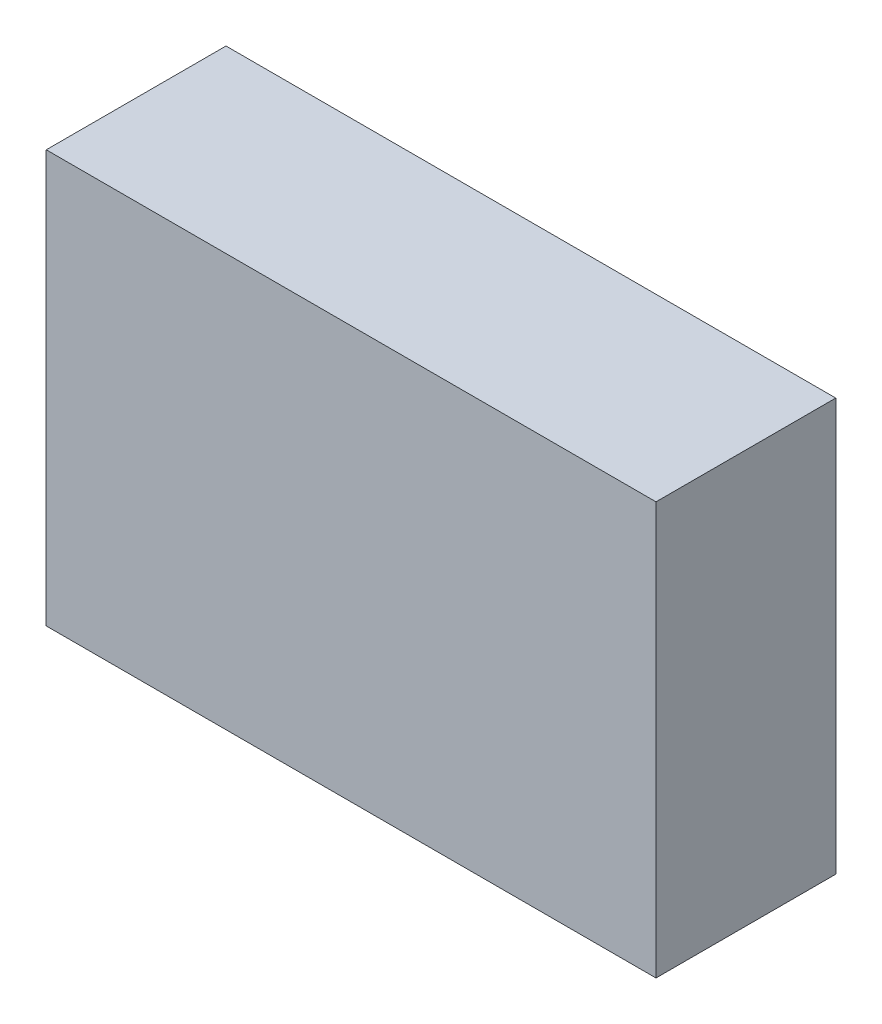
ISO-10303-21;
HEADER;
FILE_DESCRIPTION(('STEP AP214'),'2;1');
FILE_NAME('part.step','',(''),(''),'','','');
FILE_SCHEMA(('AUTOMOTIVE_DESIGN { 1 0 10303 214 1 1 1 1 }'));
ENDSEC;
DATA;
#1=APPLICATION_CONTEXT('core data for automotive mechanical design processes');
#2=APPLICATION_PROTOCOL_DEFINITION('international standard','automotive_design',2000,#1);
#3=PRODUCT_CONTEXT('',#1,'mechanical');
#4=PRODUCT('Part','Part','',(#3));
#5=PRODUCT_RELATED_PRODUCT_CATEGORY('part','',(#4));
#6=PRODUCT_DEFINITION_FORMATION('','',#4);
#7=PRODUCT_DEFINITION_CONTEXT('part definition',#1,'design');
#8=PRODUCT_DEFINITION('design','',#6,#7);
#9=PRODUCT_DEFINITION_SHAPE('','',#8);
#10=(LENGTH_UNIT() NAMED_UNIT(*) SI_UNIT(.MILLI.,.METRE.));
#11=(NAMED_UNIT(*) PLANE_ANGLE_UNIT() SI_UNIT($,.RADIAN.));
#12=(NAMED_UNIT(*) SI_UNIT($,.STERADIAN.) SOLID_ANGLE_UNIT());
#13=UNCERTAINTY_MEASURE_WITH_UNIT(LENGTH_MEASURE(1.E-05),#10,'distance_accuracy_value','');
#14=(GEOMETRIC_REPRESENTATION_CONTEXT(3) GLOBAL_UNCERTAINTY_ASSIGNED_CONTEXT((#13)) GLOBAL_UNIT_ASSIGNED_CONTEXT((#10,
#11,#12)) REPRESENTATION_CONTEXT('',''));
#15=CARTESIAN_POINT('',(0.,0.,0.));
#16=DIRECTION('',(0.,0.,1.));
#17=DIRECTION('',(1.,0.,0.));
#18=AXIS2_PLACEMENT_3D('',#15,#16,#17);
#19=CARTESIAN_POINT('',(0.,0.,5.1));
#20=DIRECTION('',(1.,0.,0.));
#21=DIRECTION('',(0.,0.,-1.));
#22=AXIS2_PLACEMENT_3D('',#19,#20,#21);
#23=PLANE('',#22);
#24=DIRECTION('',(0.,-1.,0.));
#25=VECTOR('',#24,1.);
#26=CARTESIAN_POINT('',(0.,0.,0.));
#27=LINE('',#26,#25);
#28=CARTESIAN_POINT('',(0.,11.7,0.));
#29=VERTEX_POINT('',#28);
#30=CARTESIAN_POINT('',(0.,0.,0.));
#31=VERTEX_POINT('',#30);
#32=EDGE_CURVE('E105',#29,#31,#27,.T.);
#33=ORIENTED_EDGE('',*,*,#32,.T.);
#34=DIRECTION('',(0.,0.,-1.));
#35=VECTOR('',#34,1.);
#36=CARTESIAN_POINT('',(0.,0.,5.1));
#37=LINE('',#36,#35);
#38=CARTESIAN_POINT('',(0.,0.,5.1));
#39=VERTEX_POINT('',#38);
#40=EDGE_CURVE('E11',#39,#31,#37,.T.);
#41=ORIENTED_EDGE('',*,*,#40,.F.);
#42=DIRECTION('',(0.,-1.,0.));
#43=VECTOR('',#42,1.);
#44=CARTESIAN_POINT('',(0.,0.,5.1));
#45=LINE('',#44,#43);
#46=CARTESIAN_POINT('',(0.,11.7,5.1));
#47=VERTEX_POINT('',#46);
#48=EDGE_CURVE('E89',#47,#39,#45,.T.);
#49=ORIENTED_EDGE('',*,*,#48,.F.);
#50=DIRECTION('',(0.,0.,-1.));
#51=VECTOR('',#50,1.);
#52=CARTESIAN_POINT('',(0.,11.7,5.1));
#53=LINE('',#52,#51);
#54=EDGE_CURVE('E97',#47,#29,#53,.T.);
#55=ORIENTED_EDGE('',*,*,#54,.T.);
#56=EDGE_LOOP('',(#33,#41,#49,#55));
#57=FACE_BOUND('',#56,.T.);
#58=ADVANCED_FACE('F39',(#57),#23,.F.);
#59=CARTESIAN_POINT('',(0.,0.,5.1));
#60=DIRECTION('',(0.,1.,0.));
#61=DIRECTION('',(0.,0.,1.));
#62=AXIS2_PLACEMENT_3D('',#59,#60,#61);
#63=PLANE('',#62);
#64=DIRECTION('',(1.,0.,0.));
#65=VECTOR('',#64,1.);
#66=CARTESIAN_POINT('',(0.,0.,0.));
#67=LINE('',#66,#65);
#68=CARTESIAN_POINT('',(17.3,0.,0.));
#69=VERTEX_POINT('',#68);
#70=EDGE_CURVE('E92',#31,#69,#67,.T.);
#71=ORIENTED_EDGE('',*,*,#70,.T.);
#72=DIRECTION('',(0.,0.,-1.));
#73=VECTOR('',#72,1.);
#74=CARTESIAN_POINT('',(17.3,0.,5.1));
#75=LINE('',#74,#73);
#76=CARTESIAN_POINT('',(17.3,0.,5.1));
#77=VERTEX_POINT('',#76);
#78=EDGE_CURVE('E50',#77,#69,#75,.T.);
#79=ORIENTED_EDGE('',*,*,#78,.F.);
#80=DIRECTION('',(1.,0.,0.));
#81=VECTOR('',#80,1.);
#82=CARTESIAN_POINT('',(0.,0.,5.1));
#83=LINE('',#82,#81);
#84=EDGE_CURVE('E82',#39,#77,#83,.T.);
#85=ORIENTED_EDGE('',*,*,#84,.F.);
#86=ORIENTED_EDGE('',*,*,#40,.T.);
#87=EDGE_LOOP('',(#71,#79,#85,#86));
#88=FACE_BOUND('',#87,.T.);
#89=ADVANCED_FACE('F93',(#88),#63,.F.);
#90=CARTESIAN_POINT('',(17.3,0.,5.1));
#91=DIRECTION('',(-1.,0.,0.));
#92=DIRECTION('',(0.,0.,1.));
#93=AXIS2_PLACEMENT_3D('',#90,#91,#92);
#94=PLANE('',#93);
#95=DIRECTION('',(0.,1.,0.));
#96=VECTOR('',#95,1.);
#97=CARTESIAN_POINT('',(17.3,0.,0.));
#98=LINE('',#97,#96);
#99=CARTESIAN_POINT('',(17.3,11.7,0.));
#100=VERTEX_POINT('',#99);
#101=EDGE_CURVE('E72',#69,#100,#98,.T.);
#102=ORIENTED_EDGE('',*,*,#101,.T.);
#103=DIRECTION('',(0.,0.,-1.));
#104=VECTOR('',#103,1.);
#105=CARTESIAN_POINT('',(17.3,11.7,5.1));
#106=LINE('',#105,#104);
#107=CARTESIAN_POINT('',(17.3,11.7,5.1));
#108=VERTEX_POINT('',#107);
#109=EDGE_CURVE('E94',#108,#100,#106,.T.);
#110=ORIENTED_EDGE('',*,*,#109,.F.);
#111=DIRECTION('',(0.,1.,0.));
#112=VECTOR('',#111,1.);
#113=CARTESIAN_POINT('',(17.3,0.,5.1));
#114=LINE('',#113,#112);
#115=EDGE_CURVE('E88',#77,#108,#114,.T.);
#116=ORIENTED_EDGE('',*,*,#115,.F.);
#117=ORIENTED_EDGE('',*,*,#78,.T.);
#118=EDGE_LOOP('',(#102,#110,#116,#117));
#119=FACE_BOUND('',#118,.T.);
#120=ADVANCED_FACE('F96',(#119),#94,.F.);
#121=CARTESIAN_POINT('',(0.,11.7,5.1));
#122=DIRECTION('',(0.,-1.,0.));
#123=DIRECTION('',(0.,0.,-1.));
#124=AXIS2_PLACEMENT_3D('',#121,#122,#123);
#125=PLANE('',#124);
#126=DIRECTION('',(-1.,0.,0.));
#127=VECTOR('',#126,1.);
#128=CARTESIAN_POINT('',(0.,11.7,0.));
#129=LINE('',#128,#127);
#130=EDGE_CURVE('E76',#100,#29,#129,.T.);
#131=ORIENTED_EDGE('',*,*,#130,.T.);
#132=ORIENTED_EDGE('',*,*,#54,.F.);
#133=DIRECTION('',(-1.,0.,0.));
#134=VECTOR('',#133,1.);
#135=CARTESIAN_POINT('',(0.,11.7,5.1));
#136=LINE('',#135,#134);
#137=EDGE_CURVE('E54',#108,#47,#136,.T.);
#138=ORIENTED_EDGE('',*,*,#137,.F.);
#139=ORIENTED_EDGE('',*,*,#109,.T.);
#140=EDGE_LOOP('',(#131,#132,#138,#139));
#141=FACE_BOUND('',#140,.T.);
#142=ADVANCED_FACE('F108',(#141),#125,.F.);
#143=CARTESIAN_POINT('',(0.,0.,5.1));
#144=DIRECTION('',(0.,0.,-1.));
#145=DIRECTION('',(-1.,0.,0.));
#146=AXIS2_PLACEMENT_3D('',#143,#144,#145);
#147=PLANE('',#146);
#148=ORIENTED_EDGE('',*,*,#48,.T.);
#149=ORIENTED_EDGE('',*,*,#84,.T.);
#150=ORIENTED_EDGE('',*,*,#115,.T.);
#151=ORIENTED_EDGE('',*,*,#137,.T.);
#152=EDGE_LOOP('',(#148,#149,#150,#151));
#153=FACE_BOUND('',#152,.T.);
#154=ADVANCED_FACE('F86',(#153),#147,.F.);
#155=CARTESIAN_POINT('',(0.,0.,0.));
#156=DIRECTION('',(0.,0.,-1.));
#157=DIRECTION('',(-1.,0.,0.));
#158=AXIS2_PLACEMENT_3D('',#155,#156,#157);
#159=PLANE('',#158);
#160=ORIENTED_EDGE('',*,*,#32,.F.);
#161=ORIENTED_EDGE('',*,*,#130,.F.);
#162=ORIENTED_EDGE('',*,*,#101,.F.);
#163=ORIENTED_EDGE('',*,*,#70,.F.);
#164=EDGE_LOOP('',(#160,#161,#162,#163));
#165=FACE_BOUND('',#164,.T.);
#166=ADVANCED_FACE('F115',(#165),#159,.T.);
#167=CLOSED_SHELL('',(#58,#89,#120,#142,#154,#166));
#168=MANIFOLD_SOLID_BREP('B2',#167);
#169=ADVANCED_BREP_SHAPE_REPRESENTATION('',(#18,#168),#14);
#170=SHAPE_DEFINITION_REPRESENTATION(#9,#169);
ENDSEC;
END-ISO-10303-21;
